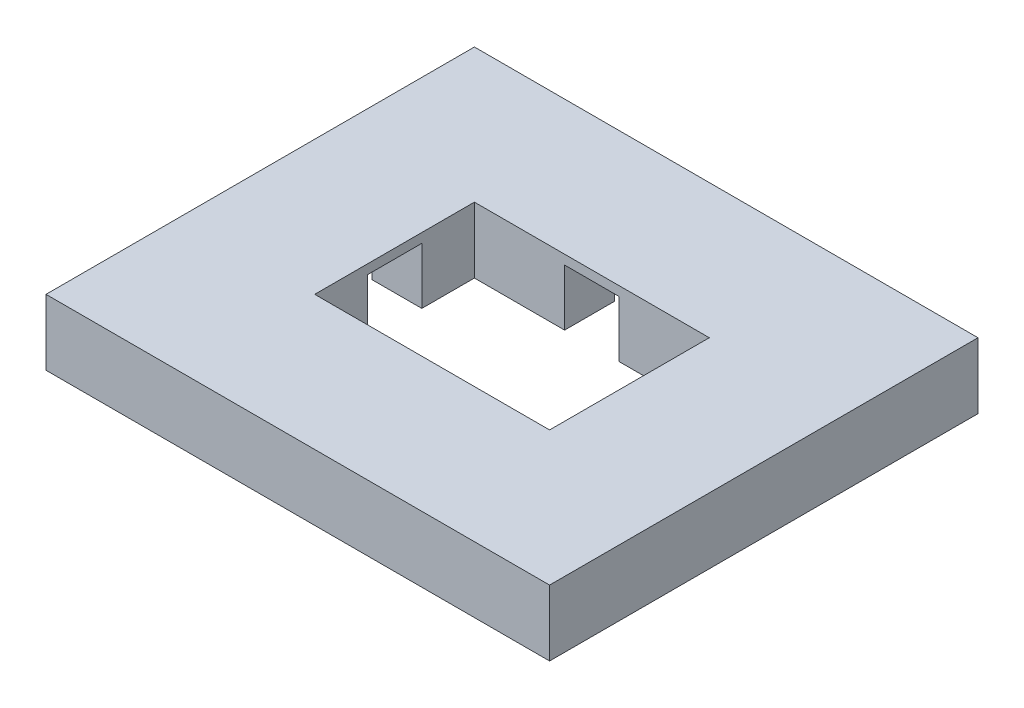
ISO-10303-21;
HEADER;
FILE_DESCRIPTION(('STEP AP214'),'2;1');
FILE_NAME('part.step','',(''),(''),'','','');
FILE_SCHEMA(('AUTOMOTIVE_DESIGN { 1 0 10303 214 1 1 1 1 }'));
ENDSEC;
DATA;
#1=APPLICATION_CONTEXT('core data for automotive mechanical design processes');
#2=APPLICATION_PROTOCOL_DEFINITION('international standard','automotive_design',2000,#1);
#3=PRODUCT_CONTEXT('',#1,'mechanical');
#4=PRODUCT('Part','Part','',(#3));
#5=PRODUCT_RELATED_PRODUCT_CATEGORY('part','',(#4));
#6=PRODUCT_DEFINITION_FORMATION('','',#4);
#7=PRODUCT_DEFINITION_CONTEXT('part definition',#1,'design');
#8=PRODUCT_DEFINITION('design','',#6,#7);
#9=PRODUCT_DEFINITION_SHAPE('','',#8);
#10=(LENGTH_UNIT() NAMED_UNIT(*) SI_UNIT(.MILLI.,.METRE.));
#11=(NAMED_UNIT(*) PLANE_ANGLE_UNIT() SI_UNIT($,.RADIAN.));
#12=(NAMED_UNIT(*) SI_UNIT($,.STERADIAN.) SOLID_ANGLE_UNIT());
#13=UNCERTAINTY_MEASURE_WITH_UNIT(LENGTH_MEASURE(1.E-05),#10,'distance_accuracy_value','');
#14=(GEOMETRIC_REPRESENTATION_CONTEXT(3) GLOBAL_UNCERTAINTY_ASSIGNED_CONTEXT((#13)) GLOBAL_UNIT_ASSIGNED_CONTEXT((#10,
#11,#12)) REPRESENTATION_CONTEXT('',''));
#15=CARTESIAN_POINT('',(0.,0.,0.));
#16=DIRECTION('',(0.,0.,1.));
#17=DIRECTION('',(1.,0.,0.));
#18=AXIS2_PLACEMENT_3D('',#15,#16,#17);
#19=CARTESIAN_POINT('',(0.,6.,0.));
#20=DIRECTION('',(0.,-1.,0.));
#21=DIRECTION('',(0.,0.,-1.));
#22=AXIS2_PLACEMENT_3D('',#19,#20,#21);
#23=PLANE('',#22);
#24=DIRECTION('',(-1.,0.,0.));
#25=VECTOR('',#24,1.);
#26=CARTESIAN_POINT('',(-12.5,6.,-8.5));
#27=LINE('',#26,#25);
#28=CARTESIAN_POINT('',(12.5,6.,-8.5));
#29=VERTEX_POINT('',#28);
#30=CARTESIAN_POINT('',(-12.5,6.,-8.5));
#31=VERTEX_POINT('',#30);
#32=EDGE_CURVE('E287',#29,#31,#27,.T.);
#33=ORIENTED_EDGE('',*,*,#32,.F.);
#34=DIRECTION('',(0.,0.,-1.));
#35=VECTOR('',#34,1.);
#36=CARTESIAN_POINT('',(12.5,6.,-8.5));
#37=LINE('',#36,#35);
#38=CARTESIAN_POINT('',(12.5,6.,8.5));
#39=VERTEX_POINT('',#38);
#40=EDGE_CURVE('E48',#39,#29,#37,.T.);
#41=ORIENTED_EDGE('',*,*,#40,.F.);
#42=DIRECTION('',(1.,0.,0.));
#43=VECTOR('',#42,1.);
#44=CARTESIAN_POINT('',(-12.5,6.,8.5));
#45=LINE('',#44,#43);
#46=CARTESIAN_POINT('',(-12.5,6.,8.5));
#47=VERTEX_POINT('',#46);
#48=EDGE_CURVE('E276',#47,#39,#45,.T.);
#49=ORIENTED_EDGE('',*,*,#48,.F.);
#50=DIRECTION('',(0.,0.,1.));
#51=VECTOR('',#50,1.);
#52=CARTESIAN_POINT('',(-12.5,6.,-8.5));
#53=LINE('',#52,#51);
#54=EDGE_CURVE('E279',#31,#47,#53,.T.);
#55=ORIENTED_EDGE('',*,*,#54,.F.);
#56=EDGE_LOOP('',(#33,#41,#49,#55));
#57=FACE_BOUND('',#56,.T.);
#58=DIRECTION('',(0.,0.,1.));
#59=VECTOR('',#58,1.);
#60=CARTESIAN_POINT('',(-26.8,6.,22.8));
#61=LINE('',#60,#59);
#62=CARTESIAN_POINT('',(-26.8,6.,-22.8));
#63=VERTEX_POINT('',#62);
#64=CARTESIAN_POINT('',(-26.8,6.,22.8));
#65=VERTEX_POINT('',#64);
#66=EDGE_CURVE('E493',#63,#65,#61,.T.);
#67=ORIENTED_EDGE('',*,*,#66,.T.);
#68=DIRECTION('',(1.,0.,0.));
#69=VECTOR('',#68,1.);
#70=CARTESIAN_POINT('',(-26.8,6.,22.8));
#71=LINE('',#70,#69);
#72=CARTESIAN_POINT('',(26.8,6.,22.8));
#73=VERTEX_POINT('',#72);
#74=EDGE_CURVE('E496',#65,#73,#71,.T.);
#75=ORIENTED_EDGE('',*,*,#74,.T.);
#76=DIRECTION('',(0.,0.,-1.));
#77=VECTOR('',#76,1.);
#78=CARTESIAN_POINT('',(26.8,6.,22.8));
#79=LINE('',#78,#77);
#80=CARTESIAN_POINT('',(26.8,6.,-22.8));
#81=VERTEX_POINT('',#80);
#82=EDGE_CURVE('E498',#73,#81,#79,.T.);
#83=ORIENTED_EDGE('',*,*,#82,.T.);
#84=DIRECTION('',(-1.,0.,0.));
#85=VECTOR('',#84,1.);
#86=CARTESIAN_POINT('',(-26.8,6.,-22.8));
#87=LINE('',#86,#85);
#88=EDGE_CURVE('E500',#81,#63,#87,.T.);
#89=ORIENTED_EDGE('',*,*,#88,.T.);
#90=EDGE_LOOP('',(#67,#75,#83,#89));
#91=FACE_BOUND('',#90,.T.);
#92=ADVANCED_FACE('F33',(#57,#91),#23,.F.);
#93=CARTESIAN_POINT('',(-26.8,6.,22.8));
#94=DIRECTION('',(1.,0.,0.));
#95=DIRECTION('',(0.,0.,-1.));
#96=AXIS2_PLACEMENT_3D('',#93,#94,#95);
#97=PLANE('',#96);
#98=DIRECTION('',(0.,-1.,0.));
#99=VECTOR('',#98,1.);
#100=CARTESIAN_POINT('',(-26.8,6.,-22.8));
#101=LINE('',#100,#99);
#102=CARTESIAN_POINT('',(-26.8,-1.,-22.8));
#103=VERTEX_POINT('',#102);
#104=EDGE_CURVE('E502',#63,#103,#101,.T.);
#105=ORIENTED_EDGE('',*,*,#104,.T.);
#106=DIRECTION('',(0.,0.,-1.));
#107=VECTOR('',#106,1.);
#108=CARTESIAN_POINT('',(-26.8,-1.,-18.8));
#109=LINE('',#108,#107);
#110=CARTESIAN_POINT('',(-26.8,-1.,-18.8));
#111=VERTEX_POINT('',#110);
#112=EDGE_CURVE('E368',#111,#103,#109,.T.);
#113=ORIENTED_EDGE('',*,*,#112,.F.);
#114=DIRECTION('',(0.,1.,0.));
#115=VECTOR('',#114,1.);
#116=CARTESIAN_POINT('',(-26.8,6.,-18.8));
#117=LINE('',#116,#115);
#118=CARTESIAN_POINT('',(-26.8,5.,-18.8));
#119=VERTEX_POINT('',#118);
#120=EDGE_CURVE('E402',#111,#119,#117,.T.);
#121=ORIENTED_EDGE('',*,*,#120,.T.);
#122=DIRECTION('',(0.,0.,-1.));
#123=VECTOR('',#122,1.);
#124=CARTESIAN_POINT('',(-26.8,5.,22.8));
#125=LINE('',#124,#123);
#126=CARTESIAN_POINT('',(-26.8,5.,-6.75288828095333));
#127=VERTEX_POINT('',#126);
#128=EDGE_CURVE('E397',#127,#119,#125,.T.);
#129=ORIENTED_EDGE('',*,*,#128,.F.);
#130=DIRECTION('',(0.,-1.,0.));
#131=VECTOR('',#130,1.);
#132=CARTESIAN_POINT('',(-26.8,6.,-6.75288828095333));
#133=LINE('',#132,#131);
#134=CARTESIAN_POINT('',(-26.8,-1.,-6.75288828095333));
#135=VERTEX_POINT('',#134);
#136=EDGE_CURVE('E400',#127,#135,#133,.T.);
#137=ORIENTED_EDGE('',*,*,#136,.T.);
#138=DIRECTION('',(0.,0.,-1.));
#139=VECTOR('',#138,1.);
#140=CARTESIAN_POINT('',(-26.8,-1.,22.8));
#141=LINE('',#140,#139);
#142=CARTESIAN_POINT('',(-26.8,-1.,22.8));
#143=VERTEX_POINT('',#142);
#144=EDGE_CURVE('E380',#143,#135,#141,.T.);
#145=ORIENTED_EDGE('',*,*,#144,.F.);
#146=DIRECTION('',(0.,-1.,0.));
#147=VECTOR('',#146,1.);
#148=CARTESIAN_POINT('',(-26.8,6.,22.8));
#149=LINE('',#148,#147);
#150=EDGE_CURVE('E508',#65,#143,#149,.T.);
#151=ORIENTED_EDGE('',*,*,#150,.F.);
#152=ORIENTED_EDGE('',*,*,#66,.F.);
#153=EDGE_LOOP('',(#105,#113,#121,#129,#137,#145,#151,#152));
#154=FACE_BOUND('',#153,.T.);
#155=ADVANCED_FACE('F35',(#154),#97,.F.);
#156=CARTESIAN_POINT('',(-26.8,6.,22.8));
#157=DIRECTION('',(0.,0.,-1.));
#158=DIRECTION('',(-1.,0.,0.));
#159=AXIS2_PLACEMENT_3D('',#156,#157,#158);
#160=PLANE('',#159);
#161=ORIENTED_EDGE('',*,*,#150,.T.);
#162=DIRECTION('',(-1.,0.,0.));
#163=VECTOR('',#162,1.);
#164=CARTESIAN_POINT('',(26.8,-1.,22.8));
#165=LINE('',#164,#163);
#166=CARTESIAN_POINT('',(26.8,-1.,22.8));
#167=VERTEX_POINT('',#166);
#168=EDGE_CURVE('E377',#167,#143,#165,.T.);
#169=ORIENTED_EDGE('',*,*,#168,.F.);
#170=DIRECTION('',(0.,-1.,0.));
#171=VECTOR('',#170,1.);
#172=CARTESIAN_POINT('',(26.8,6.,22.8));
#173=LINE('',#172,#171);
#174=EDGE_CURVE('E506',#73,#167,#173,.T.);
#175=ORIENTED_EDGE('',*,*,#174,.F.);
#176=ORIENTED_EDGE('',*,*,#74,.F.);
#177=EDGE_LOOP('',(#161,#169,#175,#176));
#178=FACE_BOUND('',#177,.T.);
#179=ADVANCED_FACE('F603',(#178),#160,.F.);
#180=CARTESIAN_POINT('',(26.8,6.,22.8));
#181=DIRECTION('',(-1.,0.,0.));
#182=DIRECTION('',(0.,0.,1.));
#183=AXIS2_PLACEMENT_3D('',#180,#181,#182);
#184=PLANE('',#183);
#185=ORIENTED_EDGE('',*,*,#174,.T.);
#186=DIRECTION('',(0.,0.,1.));
#187=VECTOR('',#186,1.);
#188=CARTESIAN_POINT('',(26.8,-1.,-22.8));
#189=LINE('',#188,#187);
#190=CARTESIAN_POINT('',(26.8,-1.,-22.8));
#191=VERTEX_POINT('',#190);
#192=EDGE_CURVE('E374',#191,#167,#189,.T.);
#193=ORIENTED_EDGE('',*,*,#192,.F.);
#194=DIRECTION('',(0.,-1.,0.));
#195=VECTOR('',#194,1.);
#196=CARTESIAN_POINT('',(26.8,6.,-22.8));
#197=LINE('',#196,#195);
#198=EDGE_CURVE('E504',#81,#191,#197,.T.);
#199=ORIENTED_EDGE('',*,*,#198,.F.);
#200=ORIENTED_EDGE('',*,*,#82,.F.);
#201=EDGE_LOOP('',(#185,#193,#199,#200));
#202=FACE_BOUND('',#201,.T.);
#203=ADVANCED_FACE('F612',(#202),#184,.F.);
#204=CARTESIAN_POINT('',(-26.8,6.,-22.8));
#205=DIRECTION('',(0.,0.,1.));
#206=DIRECTION('',(1.,0.,0.));
#207=AXIS2_PLACEMENT_3D('',#204,#205,#206);
#208=PLANE('',#207);
#209=ORIENTED_EDGE('',*,*,#198,.T.);
#210=DIRECTION('',(1.,0.,0.));
#211=VECTOR('',#210,1.);
#212=CARTESIAN_POINT('',(-26.8,-1.,-22.8));
#213=LINE('',#212,#211);
#214=EDGE_CURVE('E371',#103,#191,#213,.T.);
#215=ORIENTED_EDGE('',*,*,#214,.F.);
#216=ORIENTED_EDGE('',*,*,#104,.F.);
#217=ORIENTED_EDGE('',*,*,#88,.F.);
#218=EDGE_LOOP('',(#209,#215,#216,#217));
#219=FACE_BOUND('',#218,.T.);
#220=ADVANCED_FACE('F609',(#219),#208,.F.);
#221=CARTESIAN_POINT('',(0.,5.,2.9));
#222=DIRECTION('',(0.,0.,-1.));
#223=DIRECTION('',(-1.,0.,0.));
#224=AXIS2_PLACEMENT_3D('',#221,#222,#223);
#225=PLANE('',#224);
#226=DIRECTION('',(0.,1.,0.));
#227=VECTOR('',#226,1.);
#228=CARTESIAN_POINT('',(-12.5,5.,2.9));
#229=LINE('',#228,#227);
#230=CARTESIAN_POINT('',(-12.5,-1.,2.9));
#231=VERTEX_POINT('',#230);
#232=CARTESIAN_POINT('',(-12.5,5.,2.9));
#233=VERTEX_POINT('',#232);
#234=EDGE_CURVE('E319',#231,#233,#229,.T.);
#235=ORIENTED_EDGE('',*,*,#234,.F.);
#236=DIRECTION('',(1.,0.,0.));
#237=VECTOR('',#236,1.);
#238=CARTESIAN_POINT('',(-17.8,-1.,2.9));
#239=LINE('',#238,#237);
#240=CARTESIAN_POINT('',(-17.8,-1.,2.9));
#241=VERTEX_POINT('',#240);
#242=EDGE_CURVE('E348',#241,#231,#239,.T.);
#243=ORIENTED_EDGE('',*,*,#242,.F.);
#244=DIRECTION('',(0.,-1.,0.));
#245=VECTOR('',#244,1.);
#246=CARTESIAN_POINT('',(-17.8,5.,2.9));
#247=LINE('',#246,#245);
#248=CARTESIAN_POINT('',(-17.8,5.,2.9));
#249=VERTEX_POINT('',#248);
#250=EDGE_CURVE('E433',#249,#241,#247,.T.);
#251=ORIENTED_EDGE('',*,*,#250,.F.);
#252=DIRECTION('',(1.,0.,0.));
#253=VECTOR('',#252,1.);
#254=CARTESIAN_POINT('',(0.,5.,2.9));
#255=LINE('',#254,#253);
#256=EDGE_CURVE('E485',#249,#233,#255,.T.);
#257=ORIENTED_EDGE('',*,*,#256,.T.);
#258=EDGE_LOOP('',(#235,#243,#251,#257));
#259=FACE_BOUND('',#258,.T.);
#260=ADVANCED_FACE('F607',(#259),#225,.T.);
#261=CARTESIAN_POINT('',(0.,5.,-2.9));
#262=DIRECTION('',(0.,0.,-1.));
#263=DIRECTION('',(-1.,0.,0.));
#264=AXIS2_PLACEMENT_3D('',#261,#262,#263);
#265=PLANE('',#264);
#266=DIRECTION('',(-1.,0.,0.));
#267=VECTOR('',#266,1.);
#268=CARTESIAN_POINT('',(-11.8,-1.,-2.9));
#269=LINE('',#268,#267);
#270=CARTESIAN_POINT('',(-12.5,-1.,-2.9));
#271=VERTEX_POINT('',#270);
#272=CARTESIAN_POINT('',(-17.8,-1.,-2.9));
#273=VERTEX_POINT('',#272);
#274=EDGE_CURVE('E351',#271,#273,#269,.T.);
#275=ORIENTED_EDGE('',*,*,#274,.F.);
#276=DIRECTION('',(0.,1.,0.));
#277=VECTOR('',#276,1.);
#278=CARTESIAN_POINT('',(-12.5,5.,-2.9));
#279=LINE('',#278,#277);
#280=CARTESIAN_POINT('',(-12.5,5.,-2.9));
#281=VERTEX_POINT('',#280);
#282=EDGE_CURVE('E316',#271,#281,#279,.T.);
#283=ORIENTED_EDGE('',*,*,#282,.T.);
#284=DIRECTION('',(1.,0.,0.));
#285=VECTOR('',#284,1.);
#286=CARTESIAN_POINT('',(0.,5.,-2.9));
#287=LINE('',#286,#285);
#288=CARTESIAN_POINT('',(-17.8,5.,-2.9));
#289=VERTEX_POINT('',#288);
#290=EDGE_CURVE('E490',#289,#281,#287,.T.);
#291=ORIENTED_EDGE('',*,*,#290,.F.);
#292=DIRECTION('',(0.,-1.,0.));
#293=VECTOR('',#292,1.);
#294=CARTESIAN_POINT('',(-17.8,5.,-2.9));
#295=LINE('',#294,#293);
#296=EDGE_CURVE('E457',#289,#273,#295,.T.);
#297=ORIENTED_EDGE('',*,*,#296,.T.);
#298=EDGE_LOOP('',(#275,#283,#291,#297));
#299=FACE_BOUND('',#298,.T.);
#300=ADVANCED_FACE('F671',(#299),#265,.F.);
#301=CARTESIAN_POINT('',(-22.8,5.,0.));
#302=DIRECTION('',(1.,0.,0.));
#303=DIRECTION('',(0.,0.,-1.));
#304=AXIS2_PLACEMENT_3D('',#301,#302,#303);
#305=PLANE('',#304);
#306=DIRECTION('',(0.,-1.,0.));
#307=VECTOR('',#306,1.);
#308=CARTESIAN_POINT('',(-22.8,5.,-6.75288828095333));
#309=LINE('',#308,#307);
#310=CARTESIAN_POINT('',(-22.8,5.,-6.75288828095333));
#311=VERTEX_POINT('',#310);
#312=CARTESIAN_POINT('',(-22.8,-1.,-6.75288828095333));
#313=VERTEX_POINT('',#312);
#314=EDGE_CURVE('E395',#311,#313,#309,.T.);
#315=ORIENTED_EDGE('',*,*,#314,.F.);
#316=DIRECTION('',(0.,0.,1.));
#317=VECTOR('',#316,1.);
#318=CARTESIAN_POINT('',(-22.8,5.,0.));
#319=LINE('',#318,#317);
#320=CARTESIAN_POINT('',(-22.8,5.,18.8));
#321=VERTEX_POINT('',#320);
#322=EDGE_CURVE('E488',#311,#321,#319,.T.);
#323=ORIENTED_EDGE('',*,*,#322,.T.);
#324=DIRECTION('',(0.,-1.,0.));
#325=VECTOR('',#324,1.);
#326=CARTESIAN_POINT('',(-22.8,5.,18.8));
#327=LINE('',#326,#325);
#328=CARTESIAN_POINT('',(-22.8,-1.,18.8));
#329=VERTEX_POINT('',#328);
#330=EDGE_CURVE('E426',#321,#329,#327,.T.);
#331=ORIENTED_EDGE('',*,*,#330,.T.);
#332=DIRECTION('',(0.,0.,1.));
#333=VECTOR('',#332,1.);
#334=CARTESIAN_POINT('',(-22.8,-1.,-6.75288828095333));
#335=LINE('',#334,#333);
#336=EDGE_CURVE('E386',#313,#329,#335,.T.);
#337=ORIENTED_EDGE('',*,*,#336,.F.);
#338=EDGE_LOOP('',(#315,#323,#331,#337));
#339=FACE_BOUND('',#338,.T.);
#340=ADVANCED_FACE('F636',(#339),#305,.T.);
#341=CARTESIAN_POINT('',(0.,5.,0.));
#342=DIRECTION('',(0.,-1.,0.));
#343=DIRECTION('',(0.,0.,-1.));
#344=AXIS2_PLACEMENT_3D('',#341,#342,#343);
#345=PLANE('',#344);
#346=DIRECTION('',(0.,0.,1.));
#347=VECTOR('',#346,1.);
#348=CARTESIAN_POINT('',(12.5,5.,0.));
#349=LINE('',#348,#347);
#350=CARTESIAN_POINT('',(12.5,5.,-2.9));
#351=VERTEX_POINT('',#350);
#352=CARTESIAN_POINT('',(12.5,5.,2.9));
#353=VERTEX_POINT('',#352);
#354=EDGE_CURVE('E305',#351,#353,#349,.T.);
#355=ORIENTED_EDGE('',*,*,#354,.F.);
#356=DIRECTION('',(1.,0.,0.));
#357=VECTOR('',#356,1.);
#358=CARTESIAN_POINT('',(0.,5.,-2.9));
#359=LINE('',#358,#357);
#360=CARTESIAN_POINT('',(17.8,5.,-2.9));
#361=VERTEX_POINT('',#360);
#362=EDGE_CURVE('E460',#351,#361,#359,.T.);
#363=ORIENTED_EDGE('',*,*,#362,.T.);
#364=DIRECTION('',(0.,0.,-1.));
#365=VECTOR('',#364,1.);
#366=CARTESIAN_POINT('',(17.8,5.,-13.8));
#367=LINE('',#366,#365);
#368=CARTESIAN_POINT('',(17.8,5.,-13.8));
#369=VERTEX_POINT('',#368);
#370=EDGE_CURVE('E405',#361,#369,#367,.T.);
#371=ORIENTED_EDGE('',*,*,#370,.T.);
#372=DIRECTION('',(-1.,0.,0.));
#373=VECTOR('',#372,1.);
#374=CARTESIAN_POINT('',(2.9,5.,-13.8));
#375=LINE('',#374,#373);
#376=CARTESIAN_POINT('',(2.9,5.,-13.8));
#377=VERTEX_POINT('',#376);
#378=EDGE_CURVE('E408',#369,#377,#375,.T.);
#379=ORIENTED_EDGE('',*,*,#378,.T.);
#380=DIRECTION('',(0.,0.,1.));
#381=VECTOR('',#380,1.);
#382=CARTESIAN_POINT('',(2.9,5.,0.));
#383=LINE('',#382,#381);
#384=CARTESIAN_POINT('',(2.9,5.,-8.5));
#385=VERTEX_POINT('',#384);
#386=EDGE_CURVE('E482',#377,#385,#383,.T.);
#387=ORIENTED_EDGE('',*,*,#386,.T.);
#388=DIRECTION('',(1.,0.,0.));
#389=VECTOR('',#388,1.);
#390=CARTESIAN_POINT('',(0.,5.,-8.5));
#391=LINE('',#390,#389);
#392=CARTESIAN_POINT('',(-2.9,5.,-8.5));
#393=VERTEX_POINT('',#392);
#394=EDGE_CURVE('E310',#393,#385,#391,.T.);
#395=ORIENTED_EDGE('',*,*,#394,.F.);
#396=DIRECTION('',(0.,0.,1.));
#397=VECTOR('',#396,1.);
#398=CARTESIAN_POINT('',(-2.9,5.,0.));
#399=LINE('',#398,#397);
#400=CARTESIAN_POINT('',(-2.9,5.,-13.8));
#401=VERTEX_POINT('',#400);
#402=EDGE_CURVE('E477',#401,#393,#399,.T.);
#403=ORIENTED_EDGE('',*,*,#402,.F.);
#404=DIRECTION('',(-1.,0.,0.));
#405=VECTOR('',#404,1.);
#406=CARTESIAN_POINT('',(-2.9,5.,-13.8));
#407=LINE('',#406,#405);
#408=CARTESIAN_POINT('',(-17.8,5.,-13.8));
#409=VERTEX_POINT('',#408);
#410=EDGE_CURVE('E444',#401,#409,#407,.T.);
#411=ORIENTED_EDGE('',*,*,#410,.T.);
#412=DIRECTION('',(0.,0.,1.));
#413=VECTOR('',#412,1.);
#414=CARTESIAN_POINT('',(-17.8,5.,-13.8));
#415=LINE('',#414,#413);
#416=EDGE_CURVE('E453',#409,#289,#415,.T.);
#417=ORIENTED_EDGE('',*,*,#416,.T.);
#418=ORIENTED_EDGE('',*,*,#290,.T.);
#419=DIRECTION('',(0.,0.,-1.));
#420=VECTOR('',#419,1.);
#421=CARTESIAN_POINT('',(-12.5,5.,0.));
#422=LINE('',#421,#420);
#423=EDGE_CURVE('E314',#233,#281,#422,.T.);
#424=ORIENTED_EDGE('',*,*,#423,.F.);
#425=ORIENTED_EDGE('',*,*,#256,.F.);
#426=DIRECTION('',(0.,0.,1.));
#427=VECTOR('',#426,1.);
#428=CARTESIAN_POINT('',(-17.8,5.,13.8));
#429=LINE('',#428,#427);
#430=CARTESIAN_POINT('',(-17.8,5.,13.8));
#431=VERTEX_POINT('',#430);
#432=EDGE_CURVE('E414',#249,#431,#429,.T.);
#433=ORIENTED_EDGE('',*,*,#432,.T.);
#434=DIRECTION('',(1.,0.,0.));
#435=VECTOR('',#434,1.);
#436=CARTESIAN_POINT('',(-2.9,5.,13.8));
#437=LINE('',#436,#435);
#438=CARTESIAN_POINT('',(-2.9,5.,13.8));
#439=VERTEX_POINT('',#438);
#440=EDGE_CURVE('E423',#431,#439,#437,.T.);
#441=ORIENTED_EDGE('',*,*,#440,.T.);
#442=DIRECTION('',(0.,0.,1.));
#443=VECTOR('',#442,1.);
#444=CARTESIAN_POINT('',(-2.9,5.,0.));
#445=LINE('',#444,#443);
#446=CARTESIAN_POINT('',(-2.9,5.,8.5));
#447=VERTEX_POINT('',#446);
#448=EDGE_CURVE('E470',#447,#439,#445,.T.);
#449=ORIENTED_EDGE('',*,*,#448,.F.);
#450=DIRECTION('',(-1.,0.,0.));
#451=VECTOR('',#450,1.);
#452=CARTESIAN_POINT('',(0.,5.,8.5));
#453=LINE('',#452,#451);
#454=CARTESIAN_POINT('',(2.9,5.,8.5));
#455=VERTEX_POINT('',#454);
#456=EDGE_CURVE('E299',#455,#447,#453,.T.);
#457=ORIENTED_EDGE('',*,*,#456,.F.);
#458=DIRECTION('',(0.,0.,1.));
#459=VECTOR('',#458,1.);
#460=CARTESIAN_POINT('',(2.9,5.,0.));
#461=LINE('',#460,#459);
#462=CARTESIAN_POINT('',(2.9,5.,13.8));
#463=VERTEX_POINT('',#462);
#464=EDGE_CURVE('E472',#455,#463,#461,.T.);
#465=ORIENTED_EDGE('',*,*,#464,.T.);
#466=DIRECTION('',(1.,0.,0.));
#467=VECTOR('',#466,1.);
#468=CARTESIAN_POINT('',(2.9,5.,13.8));
#469=LINE('',#468,#467);
#470=CARTESIAN_POINT('',(17.8,5.,13.8));
#471=VERTEX_POINT('',#470);
#472=EDGE_CURVE('E430',#463,#471,#469,.T.);
#473=ORIENTED_EDGE('',*,*,#472,.T.);
#474=DIRECTION('',(0.,0.,-1.));
#475=VECTOR('',#474,1.);
#476=CARTESIAN_POINT('',(17.8,5.,13.8));
#477=LINE('',#476,#475);
#478=CARTESIAN_POINT('',(17.8,5.,2.9));
#479=VERTEX_POINT('',#478);
#480=EDGE_CURVE('E438',#471,#479,#477,.T.);
#481=ORIENTED_EDGE('',*,*,#480,.T.);
#482=DIRECTION('',(1.,0.,0.));
#483=VECTOR('',#482,1.);
#484=CARTESIAN_POINT('',(0.,5.,2.9));
#485=LINE('',#484,#483);
#486=EDGE_CURVE('E468',#353,#479,#485,.T.);
#487=ORIENTED_EDGE('',*,*,#486,.F.);
#488=EDGE_LOOP('',(#355,#363,#371,#379,#387,#395,#403,#411,#417,#418,#424,#425,#433,#441,#449,
#457,#465,#473,#481,#487));
#489=FACE_BOUND('',#488,.T.);
#490=DIRECTION('',(-1.,0.,0.));
#491=VECTOR('',#490,1.);
#492=CARTESIAN_POINT('',(0.,5.,-18.8));
#493=LINE('',#492,#491);
#494=CARTESIAN_POINT('',(22.8,5.,-18.8));
#495=VERTEX_POINT('',#494);
#496=EDGE_CURVE('E480',#495,#119,#493,.T.);
#497=ORIENTED_EDGE('',*,*,#496,.F.);
#498=DIRECTION('',(0.,0.,1.));
#499=VECTOR('',#498,1.);
#500=CARTESIAN_POINT('',(22.8,5.,0.));
#501=LINE('',#500,#499);
#502=CARTESIAN_POINT('',(22.8,5.,18.8));
#503=VERTEX_POINT('',#502);
#504=EDGE_CURVE('E465',#495,#503,#501,.T.);
#505=ORIENTED_EDGE('',*,*,#504,.T.);
#506=DIRECTION('',(-1.,0.,0.));
#507=VECTOR('',#506,1.);
#508=CARTESIAN_POINT('',(0.,5.,18.8));
#509=LINE('',#508,#507);
#510=EDGE_CURVE('E474',#503,#321,#509,.T.);
#511=ORIENTED_EDGE('',*,*,#510,.T.);
#512=ORIENTED_EDGE('',*,*,#322,.F.);
#513=DIRECTION('',(-1.,0.,0.));
#514=VECTOR('',#513,1.);
#515=CARTESIAN_POINT('',(-22.8,5.,-6.75288828095333));
#516=LINE('',#515,#514);
#517=EDGE_CURVE('E392',#311,#127,#516,.T.);
#518=ORIENTED_EDGE('',*,*,#517,.T.);
#519=ORIENTED_EDGE('',*,*,#128,.T.);
#520=EDGE_LOOP('',(#497,#505,#511,#512,#518,#519));
#521=FACE_BOUND('',#520,.T.);
#522=ADVANCED_FACE('F528',(#489,#521),#345,.T.);
#523=CARTESIAN_POINT('',(-2.9,5.,0.));
#524=DIRECTION('',(1.,0.,0.));
#525=DIRECTION('',(0.,0.,-1.));
#526=AXIS2_PLACEMENT_3D('',#523,#524,#525);
#527=PLANE('',#526);
#528=DIRECTION('',(0.,1.,0.));
#529=VECTOR('',#528,1.);
#530=CARTESIAN_POINT('',(-2.9,5.,-8.5));
#531=LINE('',#530,#529);
#532=CARTESIAN_POINT('',(-2.9,-1.,-8.5));
#533=VERTEX_POINT('',#532);
#534=EDGE_CURVE('E312',#533,#393,#531,.T.);
#535=ORIENTED_EDGE('',*,*,#534,.F.);
#536=DIRECTION('',(0.,0.,1.));
#537=VECTOR('',#536,1.);
#538=CARTESIAN_POINT('',(-2.9,-1.,-13.8));
#539=LINE('',#538,#537);
#540=CARTESIAN_POINT('',(-2.9,-1.,-13.8));
#541=VERTEX_POINT('',#540);
#542=EDGE_CURVE('E359',#541,#533,#539,.T.);
#543=ORIENTED_EDGE('',*,*,#542,.F.);
#544=DIRECTION('',(0.,-1.,0.));
#545=VECTOR('',#544,1.);
#546=CARTESIAN_POINT('',(-2.9,5.,-13.8));
#547=LINE('',#546,#545);
#548=EDGE_CURVE('E456',#401,#541,#547,.T.);
#549=ORIENTED_EDGE('',*,*,#548,.F.);
#550=ORIENTED_EDGE('',*,*,#402,.T.);
#551=EDGE_LOOP('',(#535,#543,#549,#550));
#552=FACE_BOUND('',#551,.T.);
#553=ADVANCED_FACE('F560',(#552),#527,.T.);
#554=CARTESIAN_POINT('',(2.9,5.,0.));
#555=DIRECTION('',(1.,0.,0.));
#556=DIRECTION('',(0.,0.,-1.));
#557=AXIS2_PLACEMENT_3D('',#554,#555,#556);
#558=PLANE('',#557);
#559=DIRECTION('',(0.,0.,-1.));
#560=VECTOR('',#559,1.);
#561=CARTESIAN_POINT('',(2.9,-1.,-7.8));
#562=LINE('',#561,#560);
#563=CARTESIAN_POINT('',(2.9,-1.,-8.5));
#564=VERTEX_POINT('',#563);
#565=CARTESIAN_POINT('',(2.9,-1.,-13.8));
#566=VERTEX_POINT('',#565);
#567=EDGE_CURVE('E332',#564,#566,#562,.T.);
#568=ORIENTED_EDGE('',*,*,#567,.F.);
#569=DIRECTION('',(0.,1.,0.));
#570=VECTOR('',#569,1.);
#571=CARTESIAN_POINT('',(2.9,5.,-8.5));
#572=LINE('',#571,#570);
#573=EDGE_CURVE('E265',#564,#385,#572,.T.);
#574=ORIENTED_EDGE('',*,*,#573,.T.);
#575=ORIENTED_EDGE('',*,*,#386,.F.);
#576=DIRECTION('',(0.,-1.,0.));
#577=VECTOR('',#576,1.);
#578=CARTESIAN_POINT('',(2.9,5.,-13.8));
#579=LINE('',#578,#577);
#580=EDGE_CURVE('E415',#377,#566,#579,.T.);
#581=ORIENTED_EDGE('',*,*,#580,.T.);
#582=EDGE_LOOP('',(#568,#574,#575,#581));
#583=FACE_BOUND('',#582,.T.);
#584=ADVANCED_FACE('F566',(#583),#558,.F.);
#585=CARTESIAN_POINT('',(0.,5.,-18.8));
#586=DIRECTION('',(0.,0.,1.));
#587=DIRECTION('',(1.,0.,0.));
#588=AXIS2_PLACEMENT_3D('',#585,#586,#587);
#589=PLANE('',#588);
#590=ORIENTED_EDGE('',*,*,#120,.F.);
#591=DIRECTION('',(-1.,0.,0.));
#592=VECTOR('',#591,1.);
#593=CARTESIAN_POINT('',(22.8,-1.,-18.8));
#594=LINE('',#593,#592);
#595=CARTESIAN_POINT('',(22.8,-1.,-18.8));
#596=VERTEX_POINT('',#595);
#597=EDGE_CURVE('E365',#596,#111,#594,.T.);
#598=ORIENTED_EDGE('',*,*,#597,.F.);
#599=DIRECTION('',(0.,-1.,0.));
#600=VECTOR('',#599,1.);
#601=CARTESIAN_POINT('',(22.8,5.,-18.8));
#602=LINE('',#601,#600);
#603=EDGE_CURVE('E412',#495,#596,#602,.T.);
#604=ORIENTED_EDGE('',*,*,#603,.F.);
#605=ORIENTED_EDGE('',*,*,#496,.T.);
#606=EDGE_LOOP('',(#590,#598,#604,#605));
#607=FACE_BOUND('',#606,.T.);
#608=ADVANCED_FACE('F655',(#607),#589,.T.);
#609=CARTESIAN_POINT('',(-2.9,5.,0.));
#610=DIRECTION('',(1.,0.,0.));
#611=DIRECTION('',(0.,0.,-1.));
#612=AXIS2_PLACEMENT_3D('',#609,#610,#611);
#613=PLANE('',#612);
#614=DIRECTION('',(0.,-1.,0.));
#615=VECTOR('',#614,1.);
#616=CARTESIAN_POINT('',(-2.9,5.,8.5));
#617=LINE('',#616,#615);
#618=CARTESIAN_POINT('',(-2.9,-1.,8.5));
#619=VERTEX_POINT('',#618);
#620=EDGE_CURVE('E301',#447,#619,#617,.T.);
#621=ORIENTED_EDGE('',*,*,#620,.F.);
#622=ORIENTED_EDGE('',*,*,#448,.T.);
#623=DIRECTION('',(0.,-1.,0.));
#624=VECTOR('',#623,1.);
#625=CARTESIAN_POINT('',(-2.9,5.,13.8));
#626=LINE('',#625,#624);
#627=CARTESIAN_POINT('',(-2.9,-1.,13.8));
#628=VERTEX_POINT('',#627);
#629=EDGE_CURVE('E427',#439,#628,#626,.T.);
#630=ORIENTED_EDGE('',*,*,#629,.T.);
#631=DIRECTION('',(0.,0.,1.));
#632=VECTOR('',#631,1.);
#633=CARTESIAN_POINT('',(-2.9,-1.,7.8));
#634=LINE('',#633,#632);
#635=EDGE_CURVE('E340',#619,#628,#634,.T.);
#636=ORIENTED_EDGE('',*,*,#635,.F.);
#637=EDGE_LOOP('',(#621,#622,#630,#636));
#638=FACE_BOUND('',#637,.T.);
#639=ADVANCED_FACE('F537',(#638),#613,.T.);
#640=CARTESIAN_POINT('',(0.,5.,18.8));
#641=DIRECTION('',(0.,0.,1.));
#642=DIRECTION('',(1.,0.,0.));
#643=AXIS2_PLACEMENT_3D('',#640,#641,#642);
#644=PLANE('',#643);
#645=DIRECTION('',(0.,-1.,0.));
#646=VECTOR('',#645,1.);
#647=CARTESIAN_POINT('',(22.8,5.,18.8));
#648=LINE('',#647,#646);
#649=CARTESIAN_POINT('',(22.8,-1.,18.8));
#650=VERTEX_POINT('',#649);
#651=EDGE_CURVE('E442',#503,#650,#648,.T.);
#652=ORIENTED_EDGE('',*,*,#651,.T.);
#653=DIRECTION('',(1.,0.,0.));
#654=VECTOR('',#653,1.);
#655=CARTESIAN_POINT('',(-22.8,-1.,18.8));
#656=LINE('',#655,#654);
#657=EDGE_CURVE('E389',#329,#650,#656,.T.);
#658=ORIENTED_EDGE('',*,*,#657,.F.);
#659=ORIENTED_EDGE('',*,*,#330,.F.);
#660=ORIENTED_EDGE('',*,*,#510,.F.);
#661=EDGE_LOOP('',(#652,#658,#659,#660));
#662=FACE_BOUND('',#661,.T.);
#663=ADVANCED_FACE('F641',(#662),#644,.F.);
#664=CARTESIAN_POINT('',(2.9,5.,0.));
#665=DIRECTION('',(1.,0.,0.));
#666=DIRECTION('',(0.,0.,-1.));
#667=AXIS2_PLACEMENT_3D('',#664,#665,#666);
#668=PLANE('',#667);
#669=ORIENTED_EDGE('',*,*,#464,.F.);
#670=DIRECTION('',(0.,-1.,0.));
#671=VECTOR('',#670,1.);
#672=CARTESIAN_POINT('',(2.9,5.,8.5));
#673=LINE('',#672,#671);
#674=CARTESIAN_POINT('',(2.9,-1.,8.5));
#675=VERTEX_POINT('',#674);
#676=EDGE_CURVE('E293',#455,#675,#673,.T.);
#677=ORIENTED_EDGE('',*,*,#676,.T.);
#678=DIRECTION('',(0.,0.,-1.));
#679=VECTOR('',#678,1.);
#680=CARTESIAN_POINT('',(2.9,-1.,13.8));
#681=LINE('',#680,#679);
#682=CARTESIAN_POINT('',(2.9,-1.,13.8));
#683=VERTEX_POINT('',#682);
#684=EDGE_CURVE('E329',#683,#675,#681,.T.);
#685=ORIENTED_EDGE('',*,*,#684,.F.);
#686=DIRECTION('',(0.,-1.,0.));
#687=VECTOR('',#686,1.);
#688=CARTESIAN_POINT('',(2.9,5.,13.8));
#689=LINE('',#688,#687);
#690=EDGE_CURVE('E441',#463,#683,#689,.T.);
#691=ORIENTED_EDGE('',*,*,#690,.F.);
#692=EDGE_LOOP('',(#669,#677,#685,#691));
#693=FACE_BOUND('',#692,.T.);
#694=ADVANCED_FACE('F517',(#693),#668,.F.);
#695=CARTESIAN_POINT('',(0.,5.,-2.9));
#696=DIRECTION('',(0.,0.,-1.));
#697=DIRECTION('',(-1.,0.,0.));
#698=AXIS2_PLACEMENT_3D('',#695,#696,#697);
#699=PLANE('',#698);
#700=ORIENTED_EDGE('',*,*,#362,.F.);
#701=DIRECTION('',(0.,-1.,0.));
#702=VECTOR('',#701,1.);
#703=CARTESIAN_POINT('',(12.5,5.,-2.9));
#704=LINE('',#703,#702);
#705=CARTESIAN_POINT('',(12.5,-1.,-2.9));
#706=VERTEX_POINT('',#705);
#707=EDGE_CURVE('E307',#351,#706,#704,.T.);
#708=ORIENTED_EDGE('',*,*,#707,.T.);
#709=DIRECTION('',(-1.,0.,0.));
#710=VECTOR('',#709,1.);
#711=CARTESIAN_POINT('',(17.8,-1.,-2.9));
#712=LINE('',#711,#710);
#713=CARTESIAN_POINT('',(17.8,-1.,-2.9));
#714=VERTEX_POINT('',#713);
#715=EDGE_CURVE('E275',#714,#706,#712,.T.);
#716=ORIENTED_EDGE('',*,*,#715,.F.);
#717=DIRECTION('',(0.,-1.,0.));
#718=VECTOR('',#717,1.);
#719=CARTESIAN_POINT('',(17.8,5.,-2.9));
#720=LINE('',#719,#718);
#721=EDGE_CURVE('E411',#361,#714,#720,.T.);
#722=ORIENTED_EDGE('',*,*,#721,.F.);
#723=EDGE_LOOP('',(#700,#708,#716,#722));
#724=FACE_BOUND('',#723,.T.);
#725=ADVANCED_FACE('F576',(#724),#699,.F.);
#726=CARTESIAN_POINT('',(0.,5.,2.9));
#727=DIRECTION('',(0.,0.,-1.));
#728=DIRECTION('',(-1.,0.,0.));
#729=AXIS2_PLACEMENT_3D('',#726,#727,#728);
#730=PLANE('',#729);
#731=DIRECTION('',(0.,-1.,0.));
#732=VECTOR('',#731,1.);
#733=CARTESIAN_POINT('',(12.5,5.,2.9));
#734=LINE('',#733,#732);
#735=CARTESIAN_POINT('',(12.5,-1.,2.9));
#736=VERTEX_POINT('',#735);
#737=EDGE_CURVE('E303',#353,#736,#734,.T.);
#738=ORIENTED_EDGE('',*,*,#737,.F.);
#739=ORIENTED_EDGE('',*,*,#486,.T.);
#740=DIRECTION('',(0.,-1.,0.));
#741=VECTOR('',#740,1.);
#742=CARTESIAN_POINT('',(17.8,5.,2.9));
#743=LINE('',#742,#741);
#744=CARTESIAN_POINT('',(17.8,-1.,2.9));
#745=VERTEX_POINT('',#744);
#746=EDGE_CURVE('E445',#479,#745,#743,.T.);
#747=ORIENTED_EDGE('',*,*,#746,.T.);
#748=DIRECTION('',(1.,0.,0.));
#749=VECTOR('',#748,1.);
#750=CARTESIAN_POINT('',(11.8,-1.,2.9));
#751=LINE('',#750,#749);
#752=EDGE_CURVE('E321',#736,#745,#751,.T.);
#753=ORIENTED_EDGE('',*,*,#752,.F.);
#754=EDGE_LOOP('',(#738,#739,#747,#753));
#755=FACE_BOUND('',#754,.T.);
#756=ADVANCED_FACE('F579',(#755),#730,.T.);
#757=CARTESIAN_POINT('',(22.8,5.,0.));
#758=DIRECTION('',(1.,0.,0.));
#759=DIRECTION('',(0.,0.,-1.));
#760=AXIS2_PLACEMENT_3D('',#757,#758,#759);
#761=PLANE('',#760);
#762=ORIENTED_EDGE('',*,*,#603,.T.);
#763=DIRECTION('',(0.,0.,-1.));
#764=VECTOR('',#763,1.);
#765=CARTESIAN_POINT('',(22.8,-1.,18.8));
#766=LINE('',#765,#764);
#767=EDGE_CURVE('E362',#650,#596,#766,.T.);
#768=ORIENTED_EDGE('',*,*,#767,.F.);
#769=ORIENTED_EDGE('',*,*,#651,.F.);
#770=ORIENTED_EDGE('',*,*,#504,.F.);
#771=EDGE_LOOP('',(#762,#768,#769,#770));
#772=FACE_BOUND('',#771,.T.);
#773=ADVANCED_FACE('F645',(#772),#761,.F.);
#774=CARTESIAN_POINT('',(-17.8,5.,-13.8));
#775=DIRECTION('',(1.,0.,0.));
#776=DIRECTION('',(0.,0.,-1.));
#777=AXIS2_PLACEMENT_3D('',#774,#775,#776);
#778=PLANE('',#777);
#779=DIRECTION('',(0.,-1.,0.));
#780=VECTOR('',#779,1.);
#781=CARTESIAN_POINT('',(-17.8,5.,-13.8));
#782=LINE('',#781,#780);
#783=CARTESIAN_POINT('',(-17.8,-1.,-13.8));
#784=VERTEX_POINT('',#783);
#785=EDGE_CURVE('E461',#409,#784,#782,.T.);
#786=ORIENTED_EDGE('',*,*,#785,.T.);
#787=DIRECTION('',(0.,0.,-1.));
#788=VECTOR('',#787,1.);
#789=CARTESIAN_POINT('',(-17.8,-1.,-2.9));
#790=LINE('',#789,#788);
#791=EDGE_CURVE('E353',#273,#784,#790,.T.);
#792=ORIENTED_EDGE('',*,*,#791,.F.);
#793=ORIENTED_EDGE('',*,*,#296,.F.);
#794=ORIENTED_EDGE('',*,*,#416,.F.);
#795=EDGE_LOOP('',(#786,#792,#793,#794));
#796=FACE_BOUND('',#795,.T.);
#797=ADVANCED_FACE('F592',(#796),#778,.F.);
#798=CARTESIAN_POINT('',(-2.9,5.,-13.8));
#799=DIRECTION('',(0.,0.,1.));
#800=DIRECTION('',(1.,0.,0.));
#801=AXIS2_PLACEMENT_3D('',#798,#799,#800);
#802=PLANE('',#801);
#803=ORIENTED_EDGE('',*,*,#548,.T.);
#804=DIRECTION('',(1.,0.,0.));
#805=VECTOR('',#804,1.);
#806=CARTESIAN_POINT('',(-17.8,-1.,-13.8));
#807=LINE('',#806,#805);
#808=EDGE_CURVE('E356',#784,#541,#807,.T.);
#809=ORIENTED_EDGE('',*,*,#808,.F.);
#810=ORIENTED_EDGE('',*,*,#785,.F.);
#811=ORIENTED_EDGE('',*,*,#410,.F.);
#812=EDGE_LOOP('',(#803,#809,#810,#811));
#813=FACE_BOUND('',#812,.T.);
#814=ADVANCED_FACE('F584',(#813),#802,.F.);
#815=CARTESIAN_POINT('',(17.8,5.,13.8));
#816=DIRECTION('',(-1.,0.,0.));
#817=DIRECTION('',(0.,0.,1.));
#818=AXIS2_PLACEMENT_3D('',#815,#816,#817);
#819=PLANE('',#818);
#820=DIRECTION('',(0.,-1.,0.));
#821=VECTOR('',#820,1.);
#822=CARTESIAN_POINT('',(17.8,5.,13.8));
#823=LINE('',#822,#821);
#824=CARTESIAN_POINT('',(17.8,-1.,13.8));
#825=VERTEX_POINT('',#824);
#826=EDGE_CURVE('E448',#471,#825,#823,.T.);
#827=ORIENTED_EDGE('',*,*,#826,.T.);
#828=DIRECTION('',(0.,0.,1.));
#829=VECTOR('',#828,1.);
#830=CARTESIAN_POINT('',(17.8,-1.,2.9));
#831=LINE('',#830,#829);
#832=EDGE_CURVE('E323',#745,#825,#831,.T.);
#833=ORIENTED_EDGE('',*,*,#832,.F.);
#834=ORIENTED_EDGE('',*,*,#746,.F.);
#835=ORIENTED_EDGE('',*,*,#480,.F.);
#836=EDGE_LOOP('',(#827,#833,#834,#835));
#837=FACE_BOUND('',#836,.T.);
#838=ADVANCED_FACE('F582',(#837),#819,.F.);
#839=CARTESIAN_POINT('',(2.9,5.,13.8));
#840=DIRECTION('',(0.,0.,-1.));
#841=DIRECTION('',(-1.,0.,0.));
#842=AXIS2_PLACEMENT_3D('',#839,#840,#841);
#843=PLANE('',#842);
#844=ORIENTED_EDGE('',*,*,#690,.T.);
#845=DIRECTION('',(-1.,0.,0.));
#846=VECTOR('',#845,1.);
#847=CARTESIAN_POINT('',(17.8,-1.,13.8));
#848=LINE('',#847,#846);
#849=EDGE_CURVE('E326',#825,#683,#848,.T.);
#850=ORIENTED_EDGE('',*,*,#849,.F.);
#851=ORIENTED_EDGE('',*,*,#826,.F.);
#852=ORIENTED_EDGE('',*,*,#472,.F.);
#853=EDGE_LOOP('',(#844,#850,#851,#852));
#854=FACE_BOUND('',#853,.T.);
#855=ADVANCED_FACE('F523',(#854),#843,.F.);
#856=CARTESIAN_POINT('',(-2.9,5.,13.8));
#857=DIRECTION('',(0.,0.,-1.));
#858=DIRECTION('',(-1.,0.,0.));
#859=AXIS2_PLACEMENT_3D('',#856,#857,#858);
#860=PLANE('',#859);
#861=DIRECTION('',(0.,-1.,0.));
#862=VECTOR('',#861,1.);
#863=CARTESIAN_POINT('',(-17.8,5.,13.8));
#864=LINE('',#863,#862);
#865=CARTESIAN_POINT('',(-17.8,-1.,13.8));
#866=VERTEX_POINT('',#865);
#867=EDGE_CURVE('E431',#431,#866,#864,.T.);
#868=ORIENTED_EDGE('',*,*,#867,.T.);
#869=DIRECTION('',(-1.,0.,0.));
#870=VECTOR('',#869,1.);
#871=CARTESIAN_POINT('',(-2.9,-1.,13.8));
#872=LINE('',#871,#870);
#873=EDGE_CURVE('E342',#628,#866,#872,.T.);
#874=ORIENTED_EDGE('',*,*,#873,.F.);
#875=ORIENTED_EDGE('',*,*,#629,.F.);
#876=ORIENTED_EDGE('',*,*,#440,.F.);
#877=EDGE_LOOP('',(#868,#874,#875,#876));
#878=FACE_BOUND('',#877,.T.);
#879=ADVANCED_FACE('F590',(#878),#860,.F.);
#880=CARTESIAN_POINT('',(-17.8,5.,13.8));
#881=DIRECTION('',(1.,0.,0.));
#882=DIRECTION('',(0.,0.,-1.));
#883=AXIS2_PLACEMENT_3D('',#880,#881,#882);
#884=PLANE('',#883);
#885=ORIENTED_EDGE('',*,*,#250,.T.);
#886=DIRECTION('',(0.,0.,-1.));
#887=VECTOR('',#886,1.);
#888=CARTESIAN_POINT('',(-17.8,-1.,13.8));
#889=LINE('',#888,#887);
#890=EDGE_CURVE('E345',#866,#241,#889,.T.);
#891=ORIENTED_EDGE('',*,*,#890,.F.);
#892=ORIENTED_EDGE('',*,*,#867,.F.);
#893=ORIENTED_EDGE('',*,*,#432,.F.);
#894=EDGE_LOOP('',(#885,#891,#892,#893));
#895=FACE_BOUND('',#894,.T.);
#896=ADVANCED_FACE('F794',(#895),#884,.F.);
#897=CARTESIAN_POINT('',(2.9,5.,-13.8));
#898=DIRECTION('',(0.,0.,1.));
#899=DIRECTION('',(1.,0.,0.));
#900=AXIS2_PLACEMENT_3D('',#897,#898,#899);
#901=PLANE('',#900);
#902=DIRECTION('',(0.,-1.,0.));
#903=VECTOR('',#902,1.);
#904=CARTESIAN_POINT('',(17.8,5.,-13.8));
#905=LINE('',#904,#903);
#906=CARTESIAN_POINT('',(17.8,-1.,-13.8));
#907=VERTEX_POINT('',#906);
#908=EDGE_CURVE('E418',#369,#907,#905,.T.);
#909=ORIENTED_EDGE('',*,*,#908,.T.);
#910=DIRECTION('',(1.,0.,0.));
#911=VECTOR('',#910,1.);
#912=CARTESIAN_POINT('',(2.9,-1.,-13.8));
#913=LINE('',#912,#911);
#914=EDGE_CURVE('E334',#566,#907,#913,.T.);
#915=ORIENTED_EDGE('',*,*,#914,.F.);
#916=ORIENTED_EDGE('',*,*,#580,.F.);
#917=ORIENTED_EDGE('',*,*,#378,.F.);
#918=EDGE_LOOP('',(#909,#915,#916,#917));
#919=FACE_BOUND('',#918,.T.);
#920=ADVANCED_FACE('F791',(#919),#901,.F.);
#921=CARTESIAN_POINT('',(17.8,5.,-13.8));
#922=DIRECTION('',(-1.,0.,0.));
#923=DIRECTION('',(0.,0.,1.));
#924=AXIS2_PLACEMENT_3D('',#921,#922,#923);
#925=PLANE('',#924);
#926=ORIENTED_EDGE('',*,*,#721,.T.);
#927=DIRECTION('',(0.,0.,1.));
#928=VECTOR('',#927,1.);
#929=CARTESIAN_POINT('',(17.8,-1.,-13.8));
#930=LINE('',#929,#928);
#931=EDGE_CURVE('E337',#907,#714,#930,.T.);
#932=ORIENTED_EDGE('',*,*,#931,.F.);
#933=ORIENTED_EDGE('',*,*,#908,.F.);
#934=ORIENTED_EDGE('',*,*,#370,.F.);
#935=EDGE_LOOP('',(#926,#932,#933,#934));
#936=FACE_BOUND('',#935,.T.);
#937=ADVANCED_FACE('F571',(#936),#925,.F.);
#938=CARTESIAN_POINT('',(-22.8,5.,-6.75288828095333));
#939=DIRECTION('',(0.,0.,1.));
#940=DIRECTION('',(1.,0.,0.));
#941=AXIS2_PLACEMENT_3D('',#938,#939,#940);
#942=PLANE('',#941);
#943=ORIENTED_EDGE('',*,*,#517,.F.);
#944=ORIENTED_EDGE('',*,*,#314,.T.);
#945=DIRECTION('',(1.,0.,0.));
#946=VECTOR('',#945,1.);
#947=CARTESIAN_POINT('',(-26.8,-1.,-6.75288828095333));
#948=LINE('',#947,#946);
#949=EDGE_CURVE('E383',#135,#313,#948,.T.);
#950=ORIENTED_EDGE('',*,*,#949,.F.);
#951=ORIENTED_EDGE('',*,*,#136,.F.);
#952=EDGE_LOOP('',(#943,#944,#950,#951));
#953=FACE_BOUND('',#952,.T.);
#954=ADVANCED_FACE('F631',(#953),#942,.F.);
#955=CARTESIAN_POINT('',(0.,-1.,0.));
#956=DIRECTION('',(0.,1.,0.));
#957=DIRECTION('',(0.,0.,1.));
#958=AXIS2_PLACEMENT_3D('',#955,#956,#957);
#959=PLANE('',#958);
#960=ORIENTED_EDGE('',*,*,#767,.T.);
#961=ORIENTED_EDGE('',*,*,#597,.T.);
#962=ORIENTED_EDGE('',*,*,#112,.T.);
#963=ORIENTED_EDGE('',*,*,#214,.T.);
#964=ORIENTED_EDGE('',*,*,#192,.T.);
#965=ORIENTED_EDGE('',*,*,#168,.T.);
#966=ORIENTED_EDGE('',*,*,#144,.T.);
#967=ORIENTED_EDGE('',*,*,#949,.T.);
#968=ORIENTED_EDGE('',*,*,#336,.T.);
#969=ORIENTED_EDGE('',*,*,#657,.T.);
#970=EDGE_LOOP('',(#960,#961,#962,#963,#964,#965,#966,#967,#968,#969));
#971=FACE_BOUND('',#970,.T.);
#972=ADVANCED_FACE('F626',(#971),#959,.F.);
#973=CARTESIAN_POINT('',(0.,-1.,0.));
#974=DIRECTION('',(0.,-1.,0.));
#975=DIRECTION('',(0.,0.,-1.));
#976=AXIS2_PLACEMENT_3D('',#973,#974,#975);
#977=PLANE('',#976);
#978=DIRECTION('',(0.,0.,1.));
#979=VECTOR('',#978,1.);
#980=CARTESIAN_POINT('',(-12.5,-1.,-8.5));
#981=LINE('',#980,#979);
#982=CARTESIAN_POINT('',(-12.5,-1.,-8.5));
#983=VERTEX_POINT('',#982);
#984=EDGE_CURVE('E268',#983,#271,#981,.T.);
#985=ORIENTED_EDGE('',*,*,#984,.T.);
#986=ORIENTED_EDGE('',*,*,#274,.T.);
#987=ORIENTED_EDGE('',*,*,#791,.T.);
#988=ORIENTED_EDGE('',*,*,#808,.T.);
#989=ORIENTED_EDGE('',*,*,#542,.T.);
#990=DIRECTION('',(-1.,0.,0.));
#991=VECTOR('',#990,1.);
#992=CARTESIAN_POINT('',(-12.5,-1.,-8.5));
#993=LINE('',#992,#991);
#994=EDGE_CURVE('E269',#533,#983,#993,.T.);
#995=ORIENTED_EDGE('',*,*,#994,.T.);
#996=EDGE_LOOP('',(#985,#986,#987,#988,#989,#995));
#997=FACE_BOUND('',#996,.T.);
#998=ADVANCED_FACE('F555',(#997),#977,.T.);
#999=CARTESIAN_POINT('',(0.,-1.,0.));
#1000=DIRECTION('',(0.,-1.,0.));
#1001=DIRECTION('',(0.,0.,-1.));
#1002=AXIS2_PLACEMENT_3D('',#999,#1000,#1001);
#1003=PLANE('',#1002);
#1004=DIRECTION('',(1.,0.,0.));
#1005=VECTOR('',#1004,1.);
#1006=CARTESIAN_POINT('',(-12.5,-1.,8.5));
#1007=LINE('',#1006,#1005);
#1008=CARTESIAN_POINT('',(-12.5,-1.,8.5));
#1009=VERTEX_POINT('',#1008);
#1010=EDGE_CURVE('E259',#1009,#619,#1007,.T.);
#1011=ORIENTED_EDGE('',*,*,#1010,.T.);
#1012=ORIENTED_EDGE('',*,*,#635,.T.);
#1013=ORIENTED_EDGE('',*,*,#873,.T.);
#1014=ORIENTED_EDGE('',*,*,#890,.T.);
#1015=ORIENTED_EDGE('',*,*,#242,.T.);
#1016=DIRECTION('',(0.,0.,-1.));
#1017=VECTOR('',#1016,1.);
#1018=CARTESIAN_POINT('',(-12.5,-1.,0.));
#1019=LINE('',#1018,#1017);
#1020=EDGE_CURVE('E11',#1009,#231,#1019,.T.);
#1021=ORIENTED_EDGE('',*,*,#1020,.F.);
#1022=EDGE_LOOP('',(#1011,#1012,#1013,#1014,#1015,#1021));
#1023=FACE_BOUND('',#1022,.T.);
#1024=ADVANCED_FACE('F541',(#1023),#1003,.T.);
#1025=CARTESIAN_POINT('',(0.,-1.,0.));
#1026=DIRECTION('',(0.,-1.,0.));
#1027=DIRECTION('',(0.,0.,-1.));
#1028=AXIS2_PLACEMENT_3D('',#1025,#1026,#1027);
#1029=PLANE('',#1028);
#1030=DIRECTION('',(0.,0.,-1.));
#1031=VECTOR('',#1030,1.);
#1032=CARTESIAN_POINT('',(12.5,-1.,-8.5));
#1033=LINE('',#1032,#1031);
#1034=CARTESIAN_POINT('',(12.5,-1.,-8.5));
#1035=VERTEX_POINT('',#1034);
#1036=EDGE_CURVE('E253',#706,#1035,#1033,.T.);
#1037=ORIENTED_EDGE('',*,*,#1036,.T.);
#1038=EDGE_CURVE('E262',#1035,#564,#993,.T.);
#1039=ORIENTED_EDGE('',*,*,#1038,.T.);
#1040=ORIENTED_EDGE('',*,*,#567,.T.);
#1041=ORIENTED_EDGE('',*,*,#914,.T.);
#1042=ORIENTED_EDGE('',*,*,#931,.T.);
#1043=ORIENTED_EDGE('',*,*,#715,.T.);
#1044=EDGE_LOOP('',(#1037,#1039,#1040,#1041,#1042,#1043));
#1045=FACE_BOUND('',#1044,.T.);
#1046=ADVANCED_FACE('F272',(#1045),#1029,.T.);
#1047=CARTESIAN_POINT('',(0.,-1.,0.));
#1048=DIRECTION('',(0.,-1.,0.));
#1049=DIRECTION('',(0.,0.,-1.));
#1050=AXIS2_PLACEMENT_3D('',#1047,#1048,#1049);
#1051=PLANE('',#1050);
#1052=CARTESIAN_POINT('',(12.5,-1.,8.5));
#1053=VERTEX_POINT('',#1052);
#1054=EDGE_CURVE('E54',#1053,#736,#1033,.T.);
#1055=ORIENTED_EDGE('',*,*,#1054,.T.);
#1056=ORIENTED_EDGE('',*,*,#752,.T.);
#1057=ORIENTED_EDGE('',*,*,#832,.T.);
#1058=ORIENTED_EDGE('',*,*,#849,.T.);
#1059=ORIENTED_EDGE('',*,*,#684,.T.);
#1060=DIRECTION('',(-1.,0.,0.));
#1061=VECTOR('',#1060,1.);
#1062=CARTESIAN_POINT('',(0.,-1.,8.5));
#1063=LINE('',#1062,#1061);
#1064=EDGE_CURVE('E41',#1053,#675,#1063,.T.);
#1065=ORIENTED_EDGE('',*,*,#1064,.F.);
#1066=EDGE_LOOP('',(#1055,#1056,#1057,#1058,#1059,#1065));
#1067=FACE_BOUND('',#1066,.T.);
#1068=ADVANCED_FACE('F519',(#1067),#1051,.T.);
#1069=CARTESIAN_POINT('',(12.5,-1.,-8.5));
#1070=DIRECTION('',(1.,0.,0.));
#1071=DIRECTION('',(0.,0.,-1.));
#1072=AXIS2_PLACEMENT_3D('',#1069,#1070,#1071);
#1073=PLANE('',#1072);
#1074=ORIENTED_EDGE('',*,*,#354,.T.);
#1075=ORIENTED_EDGE('',*,*,#737,.T.);
#1076=ORIENTED_EDGE('',*,*,#1054,.F.);
#1077=DIRECTION('',(0.,1.,0.));
#1078=VECTOR('',#1077,1.);
#1079=CARTESIAN_POINT('',(12.5,-1.,8.5));
#1080=LINE('',#1079,#1078);
#1081=EDGE_CURVE('E291',#1053,#39,#1080,.T.);
#1082=ORIENTED_EDGE('',*,*,#1081,.T.);
#1083=ORIENTED_EDGE('',*,*,#40,.T.);
#1084=DIRECTION('',(0.,1.,0.));
#1085=VECTOR('',#1084,1.);
#1086=CARTESIAN_POINT('',(12.5,-1.,-8.5));
#1087=LINE('',#1086,#1085);
#1088=EDGE_CURVE('E249',#1035,#29,#1087,.T.);
#1089=ORIENTED_EDGE('',*,*,#1088,.F.);
#1090=ORIENTED_EDGE('',*,*,#1036,.F.);
#1091=ORIENTED_EDGE('',*,*,#707,.F.);
#1092=EDGE_LOOP('',(#1074,#1075,#1076,#1082,#1083,#1089,#1090,#1091));
#1093=FACE_BOUND('',#1092,.T.);
#1094=ADVANCED_FACE('F251',(#1093),#1073,.F.);
#1095=CARTESIAN_POINT('',(-12.5,-1.,8.5));
#1096=DIRECTION('',(0.,0.,1.));
#1097=DIRECTION('',(1.,0.,0.));
#1098=AXIS2_PLACEMENT_3D('',#1095,#1096,#1097);
#1099=PLANE('',#1098);
#1100=ORIENTED_EDGE('',*,*,#620,.T.);
#1101=ORIENTED_EDGE('',*,*,#1010,.F.);
#1102=DIRECTION('',(0.,1.,0.));
#1103=VECTOR('',#1102,1.);
#1104=CARTESIAN_POINT('',(-12.5,-1.,8.5));
#1105=LINE('',#1104,#1103);
#1106=EDGE_CURVE('E294',#1009,#47,#1105,.T.);
#1107=ORIENTED_EDGE('',*,*,#1106,.T.);
#1108=ORIENTED_EDGE('',*,*,#48,.T.);
#1109=ORIENTED_EDGE('',*,*,#1081,.F.);
#1110=ORIENTED_EDGE('',*,*,#1064,.T.);
#1111=ORIENTED_EDGE('',*,*,#676,.F.);
#1112=ORIENTED_EDGE('',*,*,#456,.T.);
#1113=EDGE_LOOP('',(#1100,#1101,#1107,#1108,#1109,#1110,#1111,#1112));
#1114=FACE_BOUND('',#1113,.T.);
#1115=ADVANCED_FACE('F511',(#1114),#1099,.F.);
#1116=CARTESIAN_POINT('',(-12.5,-1.,-8.5));
#1117=DIRECTION('',(-1.,0.,0.));
#1118=DIRECTION('',(0.,0.,1.));
#1119=AXIS2_PLACEMENT_3D('',#1116,#1117,#1118);
#1120=PLANE('',#1119);
#1121=ORIENTED_EDGE('',*,*,#234,.T.);
#1122=ORIENTED_EDGE('',*,*,#423,.T.);
#1123=ORIENTED_EDGE('',*,*,#282,.F.);
#1124=ORIENTED_EDGE('',*,*,#984,.F.);
#1125=DIRECTION('',(0.,1.,0.));
#1126=VECTOR('',#1125,1.);
#1127=CARTESIAN_POINT('',(-12.5,-1.,-8.5));
#1128=LINE('',#1127,#1126);
#1129=EDGE_CURVE('E258',#983,#31,#1128,.T.);
#1130=ORIENTED_EDGE('',*,*,#1129,.T.);
#1131=ORIENTED_EDGE('',*,*,#54,.T.);
#1132=ORIENTED_EDGE('',*,*,#1106,.F.);
#1133=ORIENTED_EDGE('',*,*,#1020,.T.);
#1134=EDGE_LOOP('',(#1121,#1122,#1123,#1124,#1130,#1131,#1132,#1133));
#1135=FACE_BOUND('',#1134,.T.);
#1136=ADVANCED_FACE('F547',(#1135),#1120,.F.);
#1137=CARTESIAN_POINT('',(-12.5,-1.,-8.5));
#1138=DIRECTION('',(0.,0.,-1.));
#1139=DIRECTION('',(-1.,0.,0.));
#1140=AXIS2_PLACEMENT_3D('',#1137,#1138,#1139);
#1141=PLANE('',#1140);
#1142=ORIENTED_EDGE('',*,*,#534,.T.);
#1143=ORIENTED_EDGE('',*,*,#394,.T.);
#1144=ORIENTED_EDGE('',*,*,#573,.F.);
#1145=ORIENTED_EDGE('',*,*,#1038,.F.);
#1146=ORIENTED_EDGE('',*,*,#1088,.T.);
#1147=ORIENTED_EDGE('',*,*,#32,.T.);
#1148=ORIENTED_EDGE('',*,*,#1129,.F.);
#1149=ORIENTED_EDGE('',*,*,#994,.F.);
#1150=EDGE_LOOP('',(#1142,#1143,#1144,#1145,#1146,#1147,#1148,#1149));
#1151=FACE_BOUND('',#1150,.T.);
#1152=ADVANCED_FACE('F263',(#1151),#1141,.F.);
#1153=CLOSED_SHELL('',(#92,#155,#179,#203,#220,#260,#300,#340,#522,#553,#584,#608,#639,#663,
#694,#725,#756,#773,#797,#814,#838,#855,#879,#896,#920,#937,#954,#972,#998,#1024,#1046,#1068,
#1094,#1115,#1136,#1152));
#1154=MANIFOLD_SOLID_BREP('B2',#1153);
#1155=ADVANCED_BREP_SHAPE_REPRESENTATION('',(#18,#1154),#14);
#1156=SHAPE_DEFINITION_REPRESENTATION(#9,#1155);
ENDSEC;
END-ISO-10303-21;
